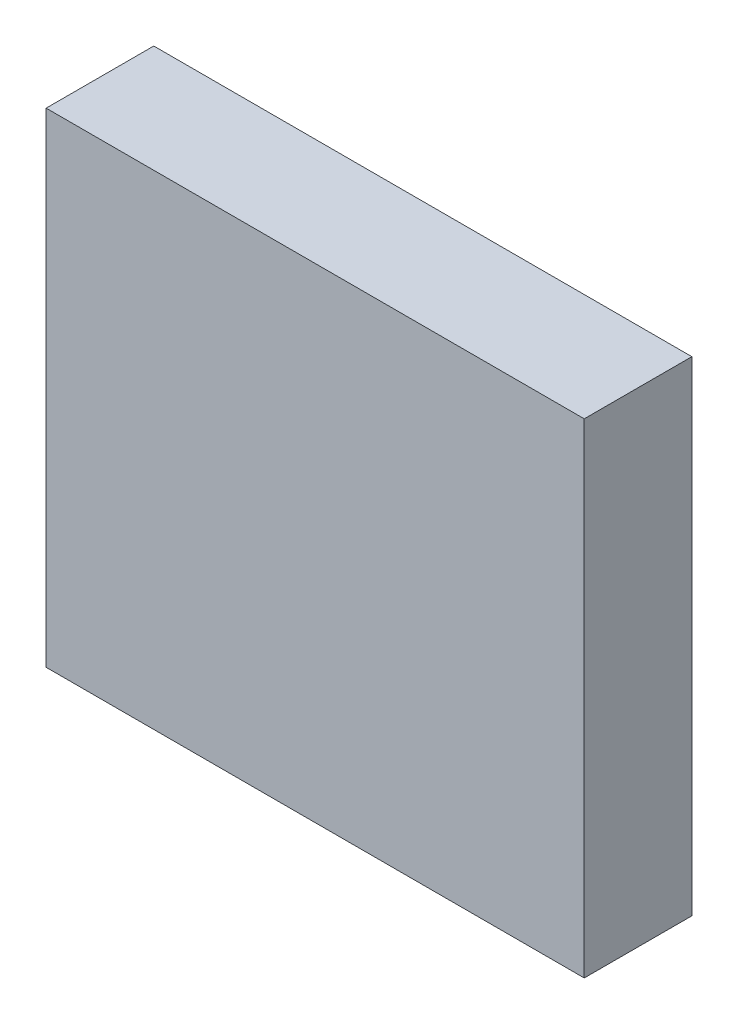
ISO-10303-21;
HEADER;
FILE_DESCRIPTION(('STEP AP214'),'2;1');
FILE_NAME('part.step','',(''),(''),'','','');
FILE_SCHEMA(('AUTOMOTIVE_DESIGN { 1 0 10303 214 1 1 1 1 }'));
ENDSEC;
DATA;
#1=APPLICATION_CONTEXT('core data for automotive mechanical design processes');
#2=APPLICATION_PROTOCOL_DEFINITION('international standard','automotive_design',2000,#1);
#3=PRODUCT_CONTEXT('',#1,'mechanical');
#4=PRODUCT('Part','Part','',(#3));
#5=PRODUCT_RELATED_PRODUCT_CATEGORY('part','',(#4));
#6=PRODUCT_DEFINITION_FORMATION('','',#4);
#7=PRODUCT_DEFINITION_CONTEXT('part definition',#1,'design');
#8=PRODUCT_DEFINITION('design','',#6,#7);
#9=PRODUCT_DEFINITION_SHAPE('','',#8);
#10=(LENGTH_UNIT() NAMED_UNIT(*) SI_UNIT(.MILLI.,.METRE.));
#11=(NAMED_UNIT(*) PLANE_ANGLE_UNIT() SI_UNIT($,.RADIAN.));
#12=(NAMED_UNIT(*) SI_UNIT($,.STERADIAN.) SOLID_ANGLE_UNIT());
#13=UNCERTAINTY_MEASURE_WITH_UNIT(LENGTH_MEASURE(1.E-05),#10,'distance_accuracy_value','');
#14=(GEOMETRIC_REPRESENTATION_CONTEXT(3) GLOBAL_UNCERTAINTY_ASSIGNED_CONTEXT((#13)) GLOBAL_UNIT_ASSIGNED_CONTEXT((#10,
#11,#12)) REPRESENTATION_CONTEXT('',''));
#15=CARTESIAN_POINT('',(0.,0.,0.));
#16=DIRECTION('',(0.,0.,1.));
#17=DIRECTION('',(1.,0.,0.));
#18=AXIS2_PLACEMENT_3D('',#15,#16,#17);
#19=CARTESIAN_POINT('',(7.5,-6.75,3.));
#20=DIRECTION('',(-1.,0.,0.));
#21=DIRECTION('',(0.,0.,1.));
#22=AXIS2_PLACEMENT_3D('',#19,#20,#21);
#23=PLANE('',#22);
#24=DIRECTION('',(0.,1.,0.));
#25=VECTOR('',#24,1.);
#26=CARTESIAN_POINT('',(7.5,-6.75,0.));
#27=LINE('',#26,#25);
#28=CARTESIAN_POINT('',(7.5,-6.75,0.));
#29=VERTEX_POINT('',#28);
#30=CARTESIAN_POINT('',(7.5,6.75,0.));
#31=VERTEX_POINT('',#30);
#32=EDGE_CURVE('E98',#29,#31,#27,.T.);
#33=ORIENTED_EDGE('',*,*,#32,.T.);
#34=DIRECTION('',(0.,0.,-1.));
#35=VECTOR('',#34,1.);
#36=CARTESIAN_POINT('',(7.5,6.75,3.));
#37=LINE('',#36,#35);
#38=CARTESIAN_POINT('',(7.5,6.75,3.));
#39=VERTEX_POINT('',#38);
#40=EDGE_CURVE('E11',#39,#31,#37,.T.);
#41=ORIENTED_EDGE('',*,*,#40,.F.);
#42=DIRECTION('',(0.,1.,0.));
#43=VECTOR('',#42,1.);
#44=CARTESIAN_POINT('',(7.5,-6.75,3.));
#45=LINE('',#44,#43);
#46=CARTESIAN_POINT('',(7.5,-6.75,3.));
#47=VERTEX_POINT('',#46);
#48=EDGE_CURVE('E86',#47,#39,#45,.T.);
#49=ORIENTED_EDGE('',*,*,#48,.F.);
#50=DIRECTION('',(0.,0.,-1.));
#51=VECTOR('',#50,1.);
#52=CARTESIAN_POINT('',(7.5,-6.75,3.));
#53=LINE('',#52,#51);
#54=EDGE_CURVE('E94',#47,#29,#53,.T.);
#55=ORIENTED_EDGE('',*,*,#54,.T.);
#56=EDGE_LOOP('',(#33,#41,#49,#55));
#57=FACE_BOUND('',#56,.T.);
#58=ADVANCED_FACE('F35',(#57),#23,.F.);
#59=CARTESIAN_POINT('',(-7.5,6.75,3.));
#60=DIRECTION('',(0.,-1.,0.));
#61=DIRECTION('',(0.,0.,-1.));
#62=AXIS2_PLACEMENT_3D('',#59,#60,#61);
#63=PLANE('',#62);
#64=DIRECTION('',(-1.,0.,0.));
#65=VECTOR('',#64,1.);
#66=CARTESIAN_POINT('',(-7.5,6.75,0.));
#67=LINE('',#66,#65);
#68=CARTESIAN_POINT('',(-7.5,6.75,0.));
#69=VERTEX_POINT('',#68);
#70=EDGE_CURVE('E90',#31,#69,#67,.T.);
#71=ORIENTED_EDGE('',*,*,#70,.T.);
#72=DIRECTION('',(0.,0.,-1.));
#73=VECTOR('',#72,1.);
#74=CARTESIAN_POINT('',(-7.5,6.75,3.));
#75=LINE('',#74,#73);
#76=CARTESIAN_POINT('',(-7.5,6.75,3.));
#77=VERTEX_POINT('',#76);
#78=EDGE_CURVE('E43',#77,#69,#75,.T.);
#79=ORIENTED_EDGE('',*,*,#78,.F.);
#80=DIRECTION('',(-1.,0.,0.));
#81=VECTOR('',#80,1.);
#82=CARTESIAN_POINT('',(-7.5,6.75,3.));
#83=LINE('',#82,#81);
#84=EDGE_CURVE('E81',#39,#77,#83,.T.);
#85=ORIENTED_EDGE('',*,*,#84,.F.);
#86=ORIENTED_EDGE('',*,*,#40,.T.);
#87=EDGE_LOOP('',(#71,#79,#85,#86));
#88=FACE_BOUND('',#87,.T.);
#89=ADVANCED_FACE('F89',(#88),#63,.F.);
#90=CARTESIAN_POINT('',(-7.5,-6.75,3.));
#91=DIRECTION('',(1.,0.,0.));
#92=DIRECTION('',(0.,0.,-1.));
#93=AXIS2_PLACEMENT_3D('',#90,#91,#92);
#94=PLANE('',#93);
#95=DIRECTION('',(0.,-1.,0.));
#96=VECTOR('',#95,1.);
#97=CARTESIAN_POINT('',(-7.5,-6.75,0.));
#98=LINE('',#97,#96);
#99=CARTESIAN_POINT('',(-7.5,-6.75,0.));
#100=VERTEX_POINT('',#99);
#101=EDGE_CURVE('E68',#69,#100,#98,.T.);
#102=ORIENTED_EDGE('',*,*,#101,.T.);
#103=DIRECTION('',(0.,0.,-1.));
#104=VECTOR('',#103,1.);
#105=CARTESIAN_POINT('',(-7.5,-6.75,3.));
#106=LINE('',#105,#104);
#107=CARTESIAN_POINT('',(-7.5,-6.75,3.));
#108=VERTEX_POINT('',#107);
#109=EDGE_CURVE('E91',#108,#100,#106,.T.);
#110=ORIENTED_EDGE('',*,*,#109,.F.);
#111=DIRECTION('',(0.,-1.,0.));
#112=VECTOR('',#111,1.);
#113=CARTESIAN_POINT('',(-7.5,-6.75,3.));
#114=LINE('',#113,#112);
#115=EDGE_CURVE('E84',#77,#108,#114,.T.);
#116=ORIENTED_EDGE('',*,*,#115,.F.);
#117=ORIENTED_EDGE('',*,*,#78,.T.);
#118=EDGE_LOOP('',(#102,#110,#116,#117));
#119=FACE_BOUND('',#118,.T.);
#120=ADVANCED_FACE('F92',(#119),#94,.F.);
#121=CARTESIAN_POINT('',(-7.5,-6.75,3.));
#122=DIRECTION('',(0.,1.,0.));
#123=DIRECTION('',(0.,0.,1.));
#124=AXIS2_PLACEMENT_3D('',#121,#122,#123);
#125=PLANE('',#124);
#126=DIRECTION('',(1.,0.,0.));
#127=VECTOR('',#126,1.);
#128=CARTESIAN_POINT('',(-7.5,-6.75,0.));
#129=LINE('',#128,#127);
#130=EDGE_CURVE('E74',#100,#29,#129,.T.);
#131=ORIENTED_EDGE('',*,*,#130,.T.);
#132=ORIENTED_EDGE('',*,*,#54,.F.);
#133=DIRECTION('',(1.,0.,0.));
#134=VECTOR('',#133,1.);
#135=CARTESIAN_POINT('',(-7.5,-6.75,3.));
#136=LINE('',#135,#134);
#137=EDGE_CURVE('E51',#108,#47,#136,.T.);
#138=ORIENTED_EDGE('',*,*,#137,.F.);
#139=ORIENTED_EDGE('',*,*,#109,.T.);
#140=EDGE_LOOP('',(#131,#132,#138,#139));
#141=FACE_BOUND('',#140,.T.);
#142=ADVANCED_FACE('F105',(#141),#125,.F.);
#143=CARTESIAN_POINT('',(0.,0.,3.));
#144=DIRECTION('',(0.,0.,-1.));
#145=DIRECTION('',(-1.,0.,0.));
#146=AXIS2_PLACEMENT_3D('',#143,#144,#145);
#147=PLANE('',#146);
#148=ORIENTED_EDGE('',*,*,#48,.T.);
#149=ORIENTED_EDGE('',*,*,#84,.T.);
#150=ORIENTED_EDGE('',*,*,#115,.T.);
#151=ORIENTED_EDGE('',*,*,#137,.T.);
#152=EDGE_LOOP('',(#148,#149,#150,#151));
#153=FACE_BOUND('',#152,.T.);
#154=ADVANCED_FACE('F82',(#153),#147,.F.);
#155=CARTESIAN_POINT('',(0.,0.,0.));
#156=DIRECTION('',(0.,0.,-1.));
#157=DIRECTION('',(-1.,0.,0.));
#158=AXIS2_PLACEMENT_3D('',#155,#156,#157);
#159=PLANE('',#158);
#160=ORIENTED_EDGE('',*,*,#32,.F.);
#161=ORIENTED_EDGE('',*,*,#130,.F.);
#162=ORIENTED_EDGE('',*,*,#101,.F.);
#163=ORIENTED_EDGE('',*,*,#70,.F.);
#164=EDGE_LOOP('',(#160,#161,#162,#163));
#165=FACE_BOUND('',#164,.T.);
#166=ADVANCED_FACE('F108',(#165),#159,.T.);
#167=CLOSED_SHELL('',(#58,#89,#120,#142,#154,#166));
#168=MANIFOLD_SOLID_BREP('B2',#167);
#169=ADVANCED_BREP_SHAPE_REPRESENTATION('',(#18,#168),#14);
#170=SHAPE_DEFINITION_REPRESENTATION(#9,#169);
ENDSEC;
END-ISO-10303-21;
